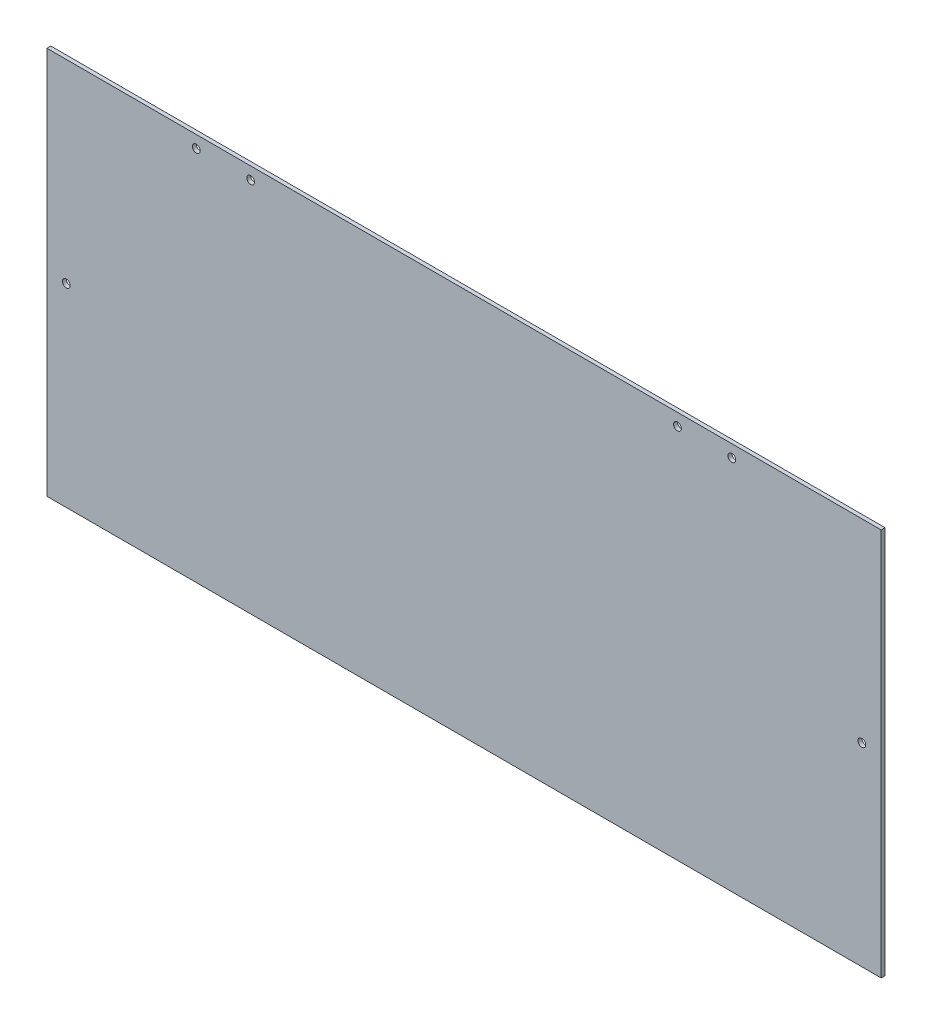
ISO-10303-21;
HEADER;
FILE_DESCRIPTION(('STEP AP214'),'2;1');
FILE_NAME('part.step','',(''),(''),'','','');
FILE_SCHEMA(('AUTOMOTIVE_DESIGN { 1 0 10303 214 1 1 1 1 }'));
ENDSEC;
DATA;
#1=APPLICATION_CONTEXT('core data for automotive mechanical design processes');
#2=APPLICATION_PROTOCOL_DEFINITION('international standard','automotive_design',2000,#1);
#3=PRODUCT_CONTEXT('',#1,'mechanical');
#4=PRODUCT('Part','Part','',(#3));
#5=PRODUCT_RELATED_PRODUCT_CATEGORY('part','',(#4));
#6=PRODUCT_DEFINITION_FORMATION('','',#4);
#7=PRODUCT_DEFINITION_CONTEXT('part definition',#1,'design');
#8=PRODUCT_DEFINITION('design','',#6,#7);
#9=PRODUCT_DEFINITION_SHAPE('','',#8);
#10=(LENGTH_UNIT() NAMED_UNIT(*) SI_UNIT(.MILLI.,.METRE.));
#11=(NAMED_UNIT(*) PLANE_ANGLE_UNIT() SI_UNIT($,.RADIAN.));
#12=(NAMED_UNIT(*) SI_UNIT($,.STERADIAN.) SOLID_ANGLE_UNIT());
#13=UNCERTAINTY_MEASURE_WITH_UNIT(LENGTH_MEASURE(1.E-05),#10,'distance_accuracy_value','');
#14=(GEOMETRIC_REPRESENTATION_CONTEXT(3) GLOBAL_UNCERTAINTY_ASSIGNED_CONTEXT((#13)) GLOBAL_UNIT_ASSIGNED_CONTEXT((#10,
#11,#12)) REPRESENTATION_CONTEXT('',''));
#15=CARTESIAN_POINT('',(0.,0.,0.));
#16=DIRECTION('',(0.,0.,1.));
#17=DIRECTION('',(1.,0.,0.));
#18=AXIS2_PLACEMENT_3D('',#15,#16,#17);
#19=CARTESIAN_POINT('',(0.,0.,2.));
#20=DIRECTION('',(0.,0.,1.));
#21=DIRECTION('',(1.,0.,0.));
#22=AXIS2_PLACEMENT_3D('',#19,#20,#21);
#23=PLANE('',#22);
#24=CARTESIAN_POINT('',(325.,-6.29999999999997,2.));
#25=DIRECTION('',(0.,0.,1.));
#26=DIRECTION('',(-1.,0.,0.));
#27=AXIS2_PLACEMENT_3D('',#24,#25,#26);
#28=CIRCLE('',#27,2.);
#29=CARTESIAN_POINT('',(323.,-6.29999999999997,2.));
#30=VERTEX_POINT('',#29);
#31=EDGE_CURVE('E134',#30,#30,#28,.T.);
#32=ORIENTED_EDGE('',*,*,#31,.F.);
#33=EDGE_LOOP('',(#32));
#34=FACE_BOUND('',#33,.T.);
#35=CARTESIAN_POINT('',(10.,-100.,2.));
#36=DIRECTION('',(0.,0.,1.));
#37=DIRECTION('',(1.,0.,0.));
#38=AXIS2_PLACEMENT_3D('',#35,#36,#37);
#39=CIRCLE('',#38,2.);
#40=CARTESIAN_POINT('',(12.,-100.,2.));
#41=VERTEX_POINT('',#40);
#42=EDGE_CURVE('E122',#41,#41,#39,.T.);
#43=ORIENTED_EDGE('',*,*,#42,.F.);
#44=EDGE_LOOP('',(#43));
#45=FACE_BOUND('',#44,.T.);
#46=CARTESIAN_POINT('',(77.,-6.3,2.));
#47=DIRECTION('',(0.,0.,1.));
#48=DIRECTION('',(1.,0.,0.));
#49=AXIS2_PLACEMENT_3D('',#46,#47,#48);
#50=CIRCLE('',#49,2.);
#51=CARTESIAN_POINT('',(79.,-6.3,2.));
#52=VERTEX_POINT('',#51);
#53=EDGE_CURVE('E101',#52,#52,#50,.T.);
#54=ORIENTED_EDGE('',*,*,#53,.F.);
#55=EDGE_LOOP('',(#54));
#56=FACE_BOUND('',#55,.T.);
#57=DIRECTION('',(0.,-1.,0.));
#58=VECTOR('',#57,1.);
#59=CARTESIAN_POINT('',(0.,0.,2.));
#60=LINE('',#59,#58);
#61=CARTESIAN_POINT('',(0.,0.,2.));
#62=VERTEX_POINT('',#61);
#63=CARTESIAN_POINT('',(0.,-200.,2.));
#64=VERTEX_POINT('',#63);
#65=EDGE_CURVE('E86',#62,#64,#60,.T.);
#66=ORIENTED_EDGE('',*,*,#65,.T.);
#67=DIRECTION('',(1.,0.,0.));
#68=VECTOR('',#67,1.);
#69=CARTESIAN_POINT('',(0.,-200.,2.));
#70=LINE('',#69,#68);
#71=CARTESIAN_POINT('',(430.,-200.,2.));
#72=VERTEX_POINT('',#71);
#73=EDGE_CURVE('E81',#64,#72,#70,.T.);
#74=ORIENTED_EDGE('',*,*,#73,.T.);
#75=DIRECTION('',(0.,1.,0.));
#76=VECTOR('',#75,1.);
#77=CARTESIAN_POINT('',(430.,0.,2.));
#78=LINE('',#77,#76);
#79=CARTESIAN_POINT('',(430.,0.,2.));
#80=VERTEX_POINT('',#79);
#81=EDGE_CURVE('E84',#72,#80,#78,.T.);
#82=ORIENTED_EDGE('',*,*,#81,.T.);
#83=DIRECTION('',(-1.,0.,0.));
#84=VECTOR('',#83,1.);
#85=CARTESIAN_POINT('',(0.,0.,2.));
#86=LINE('',#85,#84);
#87=EDGE_CURVE('E51',#80,#62,#86,.T.);
#88=ORIENTED_EDGE('',*,*,#87,.T.);
#89=EDGE_LOOP('',(#66,#74,#82,#88));
#90=FACE_BOUND('',#89,.T.);
#91=CARTESIAN_POINT('',(105.,-6.3,2.));
#92=DIRECTION('',(0.,0.,1.));
#93=DIRECTION('',(1.,0.,0.));
#94=AXIS2_PLACEMENT_3D('',#91,#92,#93);
#95=CIRCLE('',#94,2.);
#96=CARTESIAN_POINT('',(107.,-6.3,2.));
#97=VERTEX_POINT('',#96);
#98=EDGE_CURVE('E116',#97,#97,#95,.T.);
#99=ORIENTED_EDGE('',*,*,#98,.F.);
#100=EDGE_LOOP('',(#99));
#101=FACE_BOUND('',#100,.T.);
#102=CARTESIAN_POINT('',(420.,-100.,2.));
#103=DIRECTION('',(0.,0.,1.));
#104=DIRECTION('',(1.,0.,0.));
#105=AXIS2_PLACEMENT_3D('',#102,#103,#104);
#106=CIRCLE('',#105,2.);
#107=CARTESIAN_POINT('',(422.,-100.,2.));
#108=VERTEX_POINT('',#107);
#109=EDGE_CURVE('E128',#108,#108,#106,.T.);
#110=ORIENTED_EDGE('',*,*,#109,.F.);
#111=EDGE_LOOP('',(#110));
#112=FACE_BOUND('',#111,.T.);
#113=CARTESIAN_POINT('',(353.,-6.29999999999997,2.));
#114=DIRECTION('',(0.,0.,1.));
#115=DIRECTION('',(-1.,0.,0.));
#116=AXIS2_PLACEMENT_3D('',#113,#114,#115);
#117=CIRCLE('',#116,2.);
#118=CARTESIAN_POINT('',(351.,-6.29999999999997,2.));
#119=VERTEX_POINT('',#118);
#120=EDGE_CURVE('E140',#119,#119,#117,.T.);
#121=ORIENTED_EDGE('',*,*,#120,.F.);
#122=EDGE_LOOP('',(#121));
#123=FACE_BOUND('',#122,.T.);
#124=ADVANCED_FACE('F34',(#34,#45,#56,#90,#101,#112,#123),#23,.T.);
#125=CARTESIAN_POINT('',(0.,0.,0.));
#126=DIRECTION('',(0.,0.,1.));
#127=DIRECTION('',(1.,0.,0.));
#128=AXIS2_PLACEMENT_3D('',#125,#126,#127);
#129=PLANE('',#128);
#130=DIRECTION('',(0.,-1.,0.));
#131=VECTOR('',#130,1.);
#132=CARTESIAN_POINT('',(0.,0.,0.));
#133=LINE('',#132,#131);
#134=CARTESIAN_POINT('',(0.,0.,0.));
#135=VERTEX_POINT('',#134);
#136=CARTESIAN_POINT('',(0.,-200.,0.));
#137=VERTEX_POINT('',#136);
#138=EDGE_CURVE('E98',#135,#137,#133,.T.);
#139=ORIENTED_EDGE('',*,*,#138,.F.);
#140=DIRECTION('',(-1.,0.,0.));
#141=VECTOR('',#140,1.);
#142=CARTESIAN_POINT('',(0.,0.,0.));
#143=LINE('',#142,#141);
#144=CARTESIAN_POINT('',(430.,0.,0.));
#145=VERTEX_POINT('',#144);
#146=EDGE_CURVE('E74',#145,#135,#143,.T.);
#147=ORIENTED_EDGE('',*,*,#146,.F.);
#148=DIRECTION('',(0.,1.,0.));
#149=VECTOR('',#148,1.);
#150=CARTESIAN_POINT('',(430.,0.,0.));
#151=LINE('',#150,#149);
#152=CARTESIAN_POINT('',(430.,-200.,0.));
#153=VERTEX_POINT('',#152);
#154=EDGE_CURVE('E68',#153,#145,#151,.T.);
#155=ORIENTED_EDGE('',*,*,#154,.F.);
#156=DIRECTION('',(1.,0.,0.));
#157=VECTOR('',#156,1.);
#158=CARTESIAN_POINT('',(0.,-200.,0.));
#159=LINE('',#158,#157);
#160=EDGE_CURVE('E90',#137,#153,#159,.T.);
#161=ORIENTED_EDGE('',*,*,#160,.F.);
#162=EDGE_LOOP('',(#139,#147,#155,#161));
#163=FACE_BOUND('',#162,.T.);
#164=CARTESIAN_POINT('',(77.,-6.3,0.));
#165=DIRECTION('',(0.,0.,1.));
#166=DIRECTION('',(1.,0.,0.));
#167=AXIS2_PLACEMENT_3D('',#164,#165,#166);
#168=CIRCLE('',#167,2.);
#169=CARTESIAN_POINT('',(79.,-6.3,0.));
#170=VERTEX_POINT('',#169);
#171=EDGE_CURVE('E113',#170,#170,#168,.T.);
#172=ORIENTED_EDGE('',*,*,#171,.T.);
#173=EDGE_LOOP('',(#172));
#174=FACE_BOUND('',#173,.T.);
#175=CARTESIAN_POINT('',(105.,-6.3,0.));
#176=DIRECTION('',(0.,0.,1.));
#177=DIRECTION('',(1.,0.,0.));
#178=AXIS2_PLACEMENT_3D('',#175,#176,#177);
#179=CIRCLE('',#178,2.);
#180=CARTESIAN_POINT('',(107.,-6.3,0.));
#181=VERTEX_POINT('',#180);
#182=EDGE_CURVE('E119',#181,#181,#179,.T.);
#183=ORIENTED_EDGE('',*,*,#182,.T.);
#184=EDGE_LOOP('',(#183));
#185=FACE_BOUND('',#184,.T.);
#186=CARTESIAN_POINT('',(10.,-100.,0.));
#187=DIRECTION('',(0.,0.,1.));
#188=DIRECTION('',(1.,0.,0.));
#189=AXIS2_PLACEMENT_3D('',#186,#187,#188);
#190=CIRCLE('',#189,2.);
#191=CARTESIAN_POINT('',(12.,-100.,0.));
#192=VERTEX_POINT('',#191);
#193=EDGE_CURVE('E125',#192,#192,#190,.T.);
#194=ORIENTED_EDGE('',*,*,#193,.T.);
#195=EDGE_LOOP('',(#194));
#196=FACE_BOUND('',#195,.T.);
#197=CARTESIAN_POINT('',(420.,-100.,0.));
#198=DIRECTION('',(0.,0.,1.));
#199=DIRECTION('',(1.,0.,0.));
#200=AXIS2_PLACEMENT_3D('',#197,#198,#199);
#201=CIRCLE('',#200,2.);
#202=CARTESIAN_POINT('',(422.,-100.,0.));
#203=VERTEX_POINT('',#202);
#204=EDGE_CURVE('E131',#203,#203,#201,.T.);
#205=ORIENTED_EDGE('',*,*,#204,.T.);
#206=EDGE_LOOP('',(#205));
#207=FACE_BOUND('',#206,.T.);
#208=CARTESIAN_POINT('',(325.,-6.29999999999997,0.));
#209=DIRECTION('',(0.,0.,1.));
#210=DIRECTION('',(-1.,0.,0.));
#211=AXIS2_PLACEMENT_3D('',#208,#209,#210);
#212=CIRCLE('',#211,2.);
#213=CARTESIAN_POINT('',(323.,-6.29999999999997,0.));
#214=VERTEX_POINT('',#213);
#215=EDGE_CURVE('E137',#214,#214,#212,.T.);
#216=ORIENTED_EDGE('',*,*,#215,.T.);
#217=EDGE_LOOP('',(#216));
#218=FACE_BOUND('',#217,.T.);
#219=CARTESIAN_POINT('',(353.,-6.29999999999997,0.));
#220=DIRECTION('',(0.,0.,1.));
#221=DIRECTION('',(-1.,0.,0.));
#222=AXIS2_PLACEMENT_3D('',#219,#220,#221);
#223=CIRCLE('',#222,2.);
#224=CARTESIAN_POINT('',(351.,-6.29999999999997,0.));
#225=VERTEX_POINT('',#224);
#226=EDGE_CURVE('E143',#225,#225,#223,.T.);
#227=ORIENTED_EDGE('',*,*,#226,.T.);
#228=EDGE_LOOP('',(#227));
#229=FACE_BOUND('',#228,.T.);
#230=ADVANCED_FACE('F109',(#163,#174,#185,#196,#207,#218,#229),#129,.F.);
#231=CARTESIAN_POINT('',(0.,0.,2.));
#232=DIRECTION('',(1.,0.,0.));
#233=DIRECTION('',(0.,0.,-1.));
#234=AXIS2_PLACEMENT_3D('',#231,#232,#233);
#235=PLANE('',#234);
#236=ORIENTED_EDGE('',*,*,#138,.T.);
#237=DIRECTION('',(0.,0.,-1.));
#238=VECTOR('',#237,1.);
#239=CARTESIAN_POINT('',(0.,-200.,2.));
#240=LINE('',#239,#238);
#241=EDGE_CURVE('E11',#64,#137,#240,.T.);
#242=ORIENTED_EDGE('',*,*,#241,.F.);
#243=ORIENTED_EDGE('',*,*,#65,.F.);
#244=DIRECTION('',(0.,0.,-1.));
#245=VECTOR('',#244,1.);
#246=CARTESIAN_POINT('',(0.,0.,2.));
#247=LINE('',#246,#245);
#248=EDGE_CURVE('E94',#62,#135,#247,.T.);
#249=ORIENTED_EDGE('',*,*,#248,.T.);
#250=EDGE_LOOP('',(#236,#242,#243,#249));
#251=FACE_BOUND('',#250,.T.);
#252=ADVANCED_FACE('F36',(#251),#235,.F.);
#253=CARTESIAN_POINT('',(0.,-200.,2.));
#254=DIRECTION('',(0.,1.,0.));
#255=DIRECTION('',(0.,0.,1.));
#256=AXIS2_PLACEMENT_3D('',#253,#254,#255);
#257=PLANE('',#256);
#258=ORIENTED_EDGE('',*,*,#160,.T.);
#259=DIRECTION('',(0.,0.,-1.));
#260=VECTOR('',#259,1.);
#261=CARTESIAN_POINT('',(430.,-200.,2.));
#262=LINE('',#261,#260);
#263=EDGE_CURVE('E43',#72,#153,#262,.T.);
#264=ORIENTED_EDGE('',*,*,#263,.F.);
#265=ORIENTED_EDGE('',*,*,#73,.F.);
#266=ORIENTED_EDGE('',*,*,#241,.T.);
#267=EDGE_LOOP('',(#258,#264,#265,#266));
#268=FACE_BOUND('',#267,.T.);
#269=ADVANCED_FACE('F89',(#268),#257,.F.);
#270=CARTESIAN_POINT('',(430.,0.,2.));
#271=DIRECTION('',(-1.,0.,0.));
#272=DIRECTION('',(0.,0.,1.));
#273=AXIS2_PLACEMENT_3D('',#270,#271,#272);
#274=PLANE('',#273);
#275=ORIENTED_EDGE('',*,*,#154,.T.);
#276=DIRECTION('',(0.,0.,-1.));
#277=VECTOR('',#276,1.);
#278=CARTESIAN_POINT('',(430.,0.,2.));
#279=LINE('',#278,#277);
#280=EDGE_CURVE('E91',#80,#145,#279,.T.);
#281=ORIENTED_EDGE('',*,*,#280,.F.);
#282=ORIENTED_EDGE('',*,*,#81,.F.);
#283=ORIENTED_EDGE('',*,*,#263,.T.);
#284=EDGE_LOOP('',(#275,#281,#282,#283));
#285=FACE_BOUND('',#284,.T.);
#286=ADVANCED_FACE('F92',(#285),#274,.F.);
#287=CARTESIAN_POINT('',(0.,0.,2.));
#288=DIRECTION('',(0.,-1.,0.));
#289=DIRECTION('',(0.,0.,-1.));
#290=AXIS2_PLACEMENT_3D('',#287,#288,#289);
#291=PLANE('',#290);
#292=ORIENTED_EDGE('',*,*,#146,.T.);
#293=ORIENTED_EDGE('',*,*,#248,.F.);
#294=ORIENTED_EDGE('',*,*,#87,.F.);
#295=ORIENTED_EDGE('',*,*,#280,.T.);
#296=EDGE_LOOP('',(#292,#293,#294,#295));
#297=FACE_BOUND('',#296,.T.);
#298=ADVANCED_FACE('F106',(#297),#291,.F.);
#299=CARTESIAN_POINT('',(77.,-6.3,2.));
#300=DIRECTION('',(0.,0.,-1.));
#301=DIRECTION('',(-1.,0.,0.));
#302=AXIS2_PLACEMENT_3D('',#299,#300,#301);
#303=CYLINDRICAL_SURFACE('',#302,2.);
#304=ORIENTED_EDGE('',*,*,#53,.T.);
#305=EDGE_LOOP('',(#304));
#306=FACE_BOUND('',#305,.T.);
#307=ORIENTED_EDGE('',*,*,#171,.F.);
#308=EDGE_LOOP('',(#307));
#309=FACE_BOUND('',#308,.T.);
#310=ADVANCED_FACE('F162',(#306,#309),#303,.F.);
#311=CARTESIAN_POINT('',(105.,-6.3,2.));
#312=DIRECTION('',(0.,0.,-1.));
#313=DIRECTION('',(-1.,0.,0.));
#314=AXIS2_PLACEMENT_3D('',#311,#312,#313);
#315=CYLINDRICAL_SURFACE('',#314,2.);
#316=ORIENTED_EDGE('',*,*,#98,.T.);
#317=EDGE_LOOP('',(#316));
#318=FACE_BOUND('',#317,.T.);
#319=ORIENTED_EDGE('',*,*,#182,.F.);
#320=EDGE_LOOP('',(#319));
#321=FACE_BOUND('',#320,.T.);
#322=ADVANCED_FACE('F208',(#318,#321),#315,.F.);
#323=CARTESIAN_POINT('',(10.,-100.,2.));
#324=DIRECTION('',(0.,0.,-1.));
#325=DIRECTION('',(-1.,0.,0.));
#326=AXIS2_PLACEMENT_3D('',#323,#324,#325);
#327=CYLINDRICAL_SURFACE('',#326,2.);
#328=ORIENTED_EDGE('',*,*,#42,.T.);
#329=EDGE_LOOP('',(#328));
#330=FACE_BOUND('',#329,.T.);
#331=ORIENTED_EDGE('',*,*,#193,.F.);
#332=EDGE_LOOP('',(#331));
#333=FACE_BOUND('',#332,.T.);
#334=ADVANCED_FACE('F216',(#330,#333),#327,.F.);
#335=CARTESIAN_POINT('',(420.,-100.,2.));
#336=DIRECTION('',(0.,0.,-1.));
#337=DIRECTION('',(-1.,0.,0.));
#338=AXIS2_PLACEMENT_3D('',#335,#336,#337);
#339=CYLINDRICAL_SURFACE('',#338,2.);
#340=ORIENTED_EDGE('',*,*,#109,.T.);
#341=EDGE_LOOP('',(#340));
#342=FACE_BOUND('',#341,.T.);
#343=ORIENTED_EDGE('',*,*,#204,.F.);
#344=EDGE_LOOP('',(#343));
#345=FACE_BOUND('',#344,.T.);
#346=ADVANCED_FACE('F224',(#342,#345),#339,.F.);
#347=CARTESIAN_POINT('',(325.,-6.29999999999997,2.));
#348=DIRECTION('',(0.,0.,-1.));
#349=DIRECTION('',(-1.,0.,0.));
#350=AXIS2_PLACEMENT_3D('',#347,#348,#349);
#351=CYLINDRICAL_SURFACE('',#350,2.);
#352=ORIENTED_EDGE('',*,*,#31,.T.);
#353=EDGE_LOOP('',(#352));
#354=FACE_BOUND('',#353,.T.);
#355=ORIENTED_EDGE('',*,*,#215,.F.);
#356=EDGE_LOOP('',(#355));
#357=FACE_BOUND('',#356,.T.);
#358=ADVANCED_FACE('F233',(#354,#357),#351,.F.);
#359=CARTESIAN_POINT('',(353.,-6.29999999999997,2.));
#360=DIRECTION('',(0.,0.,-1.));
#361=DIRECTION('',(-1.,0.,0.));
#362=AXIS2_PLACEMENT_3D('',#359,#360,#361);
#363=CYLINDRICAL_SURFACE('',#362,2.);
#364=ORIENTED_EDGE('',*,*,#120,.T.);
#365=EDGE_LOOP('',(#364));
#366=FACE_BOUND('',#365,.T.);
#367=ORIENTED_EDGE('',*,*,#226,.F.);
#368=EDGE_LOOP('',(#367));
#369=FACE_BOUND('',#368,.T.);
#370=ADVANCED_FACE('F149',(#366,#369),#363,.F.);
#371=CLOSED_SHELL('',(#124,#230,#252,#269,#286,#298,#310,#322,#334,#346,#358,#370));
#372=MANIFOLD_SOLID_BREP('B2',#371);
#373=ADVANCED_BREP_SHAPE_REPRESENTATION('',(#18,#372),#14);
#374=SHAPE_DEFINITION_REPRESENTATION(#9,#373);
ENDSEC;
END-ISO-10303-21;
